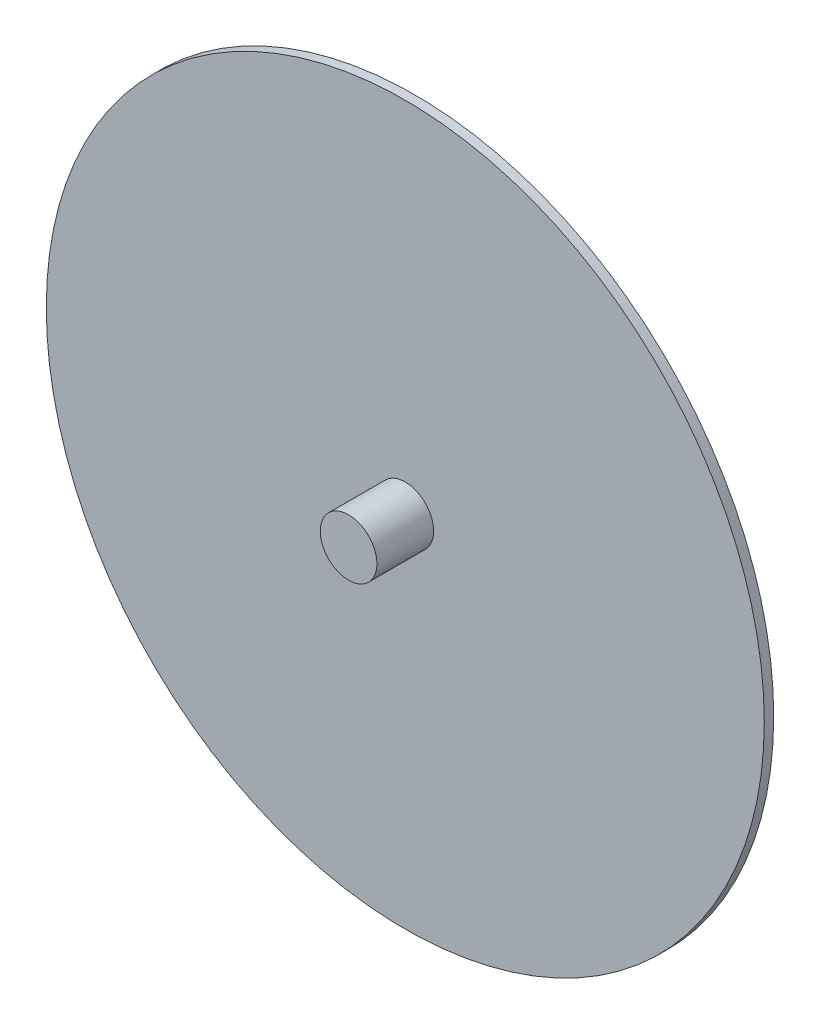
ISO-10303-21;
HEADER;
FILE_DESCRIPTION(('STEP AP214'),'2;1');
FILE_NAME('part.step','',(''),(''),'','','');
FILE_SCHEMA(('AUTOMOTIVE_DESIGN { 1 0 10303 214 1 1 1 1 }'));
ENDSEC;
DATA;
#1=APPLICATION_CONTEXT('core data for automotive mechanical design processes');
#2=APPLICATION_PROTOCOL_DEFINITION('international standard','automotive_design',2000,#1);
#3=PRODUCT_CONTEXT('',#1,'mechanical');
#4=PRODUCT('Part','Part','',(#3));
#5=PRODUCT_RELATED_PRODUCT_CATEGORY('part','',(#4));
#6=PRODUCT_DEFINITION_FORMATION('','',#4);
#7=PRODUCT_DEFINITION_CONTEXT('part definition',#1,'design');
#8=PRODUCT_DEFINITION('design','',#6,#7);
#9=PRODUCT_DEFINITION_SHAPE('','',#8);
#10=(LENGTH_UNIT() NAMED_UNIT(*) SI_UNIT(.MILLI.,.METRE.));
#11=(NAMED_UNIT(*) PLANE_ANGLE_UNIT() SI_UNIT($,.RADIAN.));
#12=(NAMED_UNIT(*) SI_UNIT($,.STERADIAN.) SOLID_ANGLE_UNIT());
#13=UNCERTAINTY_MEASURE_WITH_UNIT(LENGTH_MEASURE(1.E-05),#10,'distance_accuracy_value','');
#14=(GEOMETRIC_REPRESENTATION_CONTEXT(3) GLOBAL_UNCERTAINTY_ASSIGNED_CONTEXT((#13)) GLOBAL_UNIT_ASSIGNED_CONTEXT((#10,
#11,#12)) REPRESENTATION_CONTEXT('',''));
#15=CARTESIAN_POINT('',(0.,0.,0.));
#16=DIRECTION('',(0.,0.,1.));
#17=DIRECTION('',(1.,0.,0.));
#18=AXIS2_PLACEMENT_3D('',#15,#16,#17);
#19=CARTESIAN_POINT('',(0.,0.,10.));
#20=DIRECTION('',(0.,0.,-1.));
#21=DIRECTION('',(-1.,0.,0.));
#22=AXIS2_PLACEMENT_3D('',#19,#20,#21);
#23=CYLINDRICAL_SURFACE('',#22,380.);
#24=CARTESIAN_POINT('',(0.,0.,10.));
#25=DIRECTION('',(0.,0.,1.));
#26=DIRECTION('',(1.,0.,0.));
#27=AXIS2_PLACEMENT_3D('',#24,#25,#26);
#28=CIRCLE('',#27,380.);
#29=CARTESIAN_POINT('',(380.,0.,10.));
#30=VERTEX_POINT('',#29);
#31=EDGE_CURVE('E10',#30,#30,#28,.T.);
#32=ORIENTED_EDGE('',*,*,#31,.F.);
#33=EDGE_LOOP('',(#32));
#34=FACE_BOUND('',#33,.T.);
#35=CARTESIAN_POINT('',(0.,0.,0.));
#36=DIRECTION('',(0.,0.,1.));
#37=DIRECTION('',(1.,0.,0.));
#38=AXIS2_PLACEMENT_3D('',#35,#36,#37);
#39=CIRCLE('',#38,380.);
#40=CARTESIAN_POINT('',(380.,0.,0.));
#41=VERTEX_POINT('',#40);
#42=EDGE_CURVE('E42',#41,#41,#39,.T.);
#43=ORIENTED_EDGE('',*,*,#42,.T.);
#44=EDGE_LOOP('',(#43));
#45=FACE_BOUND('',#44,.T.);
#46=ADVANCED_FACE('F39',(#34,#45),#23,.T.);
#47=CARTESIAN_POINT('',(0.,0.,10.));
#48=DIRECTION('',(0.,0.,1.));
#49=DIRECTION('',(1.,0.,0.));
#50=AXIS2_PLACEMENT_3D('',#47,#48,#49);
#51=PLANE('',#50);
#52=CARTESIAN_POINT('',(0.,0.,10.));
#53=DIRECTION('',(0.,0.,1.));
#54=DIRECTION('',(1.,0.,0.));
#55=AXIS2_PLACEMENT_3D('',#52,#53,#54);
#56=CIRCLE('',#55,30.);
#57=CARTESIAN_POINT('',(30.,0.,10.));
#58=VERTEX_POINT('',#57);
#59=EDGE_CURVE('E51',#58,#58,#56,.T.);
#60=ORIENTED_EDGE('',*,*,#59,.F.);
#61=EDGE_LOOP('',(#60));
#62=FACE_BOUND('',#61,.T.);
#63=ORIENTED_EDGE('',*,*,#31,.T.);
#64=EDGE_LOOP('',(#63));
#65=FACE_BOUND('',#64,.T.);
#66=ADVANCED_FACE('F66',(#62,#65),#51,.T.);
#67=CARTESIAN_POINT('',(0.,0.,0.));
#68=DIRECTION('',(0.,0.,1.));
#69=DIRECTION('',(1.,0.,0.));
#70=AXIS2_PLACEMENT_3D('',#67,#68,#69);
#71=PLANE('',#70);
#72=ORIENTED_EDGE('',*,*,#42,.F.);
#73=EDGE_LOOP('',(#72));
#74=FACE_BOUND('',#73,.T.);
#75=ADVANCED_FACE('F62',(#74),#71,.F.);
#76=CARTESIAN_POINT('',(0.,0.,70.));
#77=DIRECTION('',(0.,0.,-1.));
#78=DIRECTION('',(-1.,0.,0.));
#79=AXIS2_PLACEMENT_3D('',#76,#77,#78);
#80=CYLINDRICAL_SURFACE('',#79,30.);
#81=CARTESIAN_POINT('',(0.,0.,70.));
#82=DIRECTION('',(0.,0.,1.));
#83=DIRECTION('',(1.,0.,0.));
#84=AXIS2_PLACEMENT_3D('',#81,#82,#83);
#85=CIRCLE('',#84,30.);
#86=CARTESIAN_POINT('',(30.,0.,70.));
#87=VERTEX_POINT('',#86);
#88=EDGE_CURVE('E49',#87,#87,#85,.T.);
#89=ORIENTED_EDGE('',*,*,#88,.F.);
#90=EDGE_LOOP('',(#89));
#91=FACE_BOUND('',#90,.T.);
#92=ORIENTED_EDGE('',*,*,#59,.T.);
#93=EDGE_LOOP('',(#92));
#94=FACE_BOUND('',#93,.T.);
#95=ADVANCED_FACE('F59',(#91,#94),#80,.T.);
#96=CARTESIAN_POINT('',(0.,0.,70.));
#97=DIRECTION('',(0.,0.,1.));
#98=DIRECTION('',(1.,0.,0.));
#99=AXIS2_PLACEMENT_3D('',#96,#97,#98);
#100=PLANE('',#99);
#101=ORIENTED_EDGE('',*,*,#88,.T.);
#102=EDGE_LOOP('',(#101));
#103=FACE_BOUND('',#102,.T.);
#104=ADVANCED_FACE('F57',(#103),#100,.T.);
#105=CLOSED_SHELL('',(#46,#66,#75,#95,#104));
#106=MANIFOLD_SOLID_BREP('B2',#105);
#107=ADVANCED_BREP_SHAPE_REPRESENTATION('',(#18,#106),#14);
#108=SHAPE_DEFINITION_REPRESENTATION(#9,#107);
ENDSEC;
END-ISO-10303-21;
